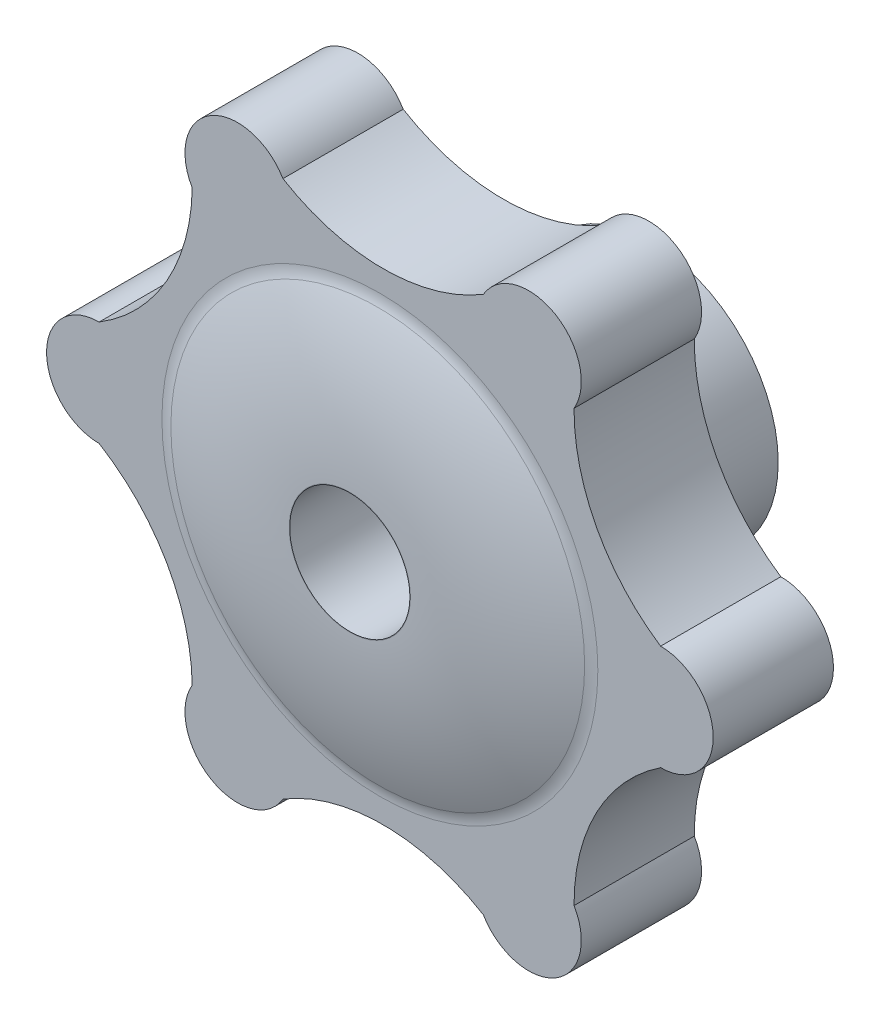
ISO-10303-21;
HEADER;
FILE_DESCRIPTION(('STEP AP214'),'2;1');
FILE_NAME('part.step','',(''),(''),'','','');
FILE_SCHEMA(('AUTOMOTIVE_DESIGN { 1 0 10303 214 1 1 1 1 }'));
ENDSEC;
DATA;
#1=APPLICATION_CONTEXT('core data for automotive mechanical design processes');
#2=APPLICATION_PROTOCOL_DEFINITION('international standard','automotive_design',2000,#1);
#3=PRODUCT_CONTEXT('',#1,'mechanical');
#4=PRODUCT('Part','Part','',(#3));
#5=PRODUCT_RELATED_PRODUCT_CATEGORY('part','',(#4));
#6=PRODUCT_DEFINITION_FORMATION('','',#4);
#7=PRODUCT_DEFINITION_CONTEXT('part definition',#1,'design');
#8=PRODUCT_DEFINITION('design','',#6,#7);
#9=PRODUCT_DEFINITION_SHAPE('','',#8);
#10=(LENGTH_UNIT() NAMED_UNIT(*) SI_UNIT(.MILLI.,.METRE.));
#11=(NAMED_UNIT(*) PLANE_ANGLE_UNIT() SI_UNIT($,.RADIAN.));
#12=(NAMED_UNIT(*) SI_UNIT($,.STERADIAN.) SOLID_ANGLE_UNIT());
#13=UNCERTAINTY_MEASURE_WITH_UNIT(LENGTH_MEASURE(1.E-05),#10,'distance_accuracy_value','');
#14=(GEOMETRIC_REPRESENTATION_CONTEXT(3) GLOBAL_UNCERTAINTY_ASSIGNED_CONTEXT((#13)) GLOBAL_UNIT_ASSIGNED_CONTEXT((#10,
#11,#12)) REPRESENTATION_CONTEXT('',''));
#15=CARTESIAN_POINT('',(0.,0.,0.));
#16=DIRECTION('',(0.,0.,1.));
#17=DIRECTION('',(1.,0.,0.));
#18=AXIS2_PLACEMENT_3D('',#15,#16,#17);
#19=CARTESIAN_POINT('',(0.217287644994759,-28.9128958259195,8.));
#20=DIRECTION('',(0.,0.,-1.));
#21=DIRECTION('',(-1.,0.,0.));
#22=AXIS2_PLACEMENT_3D('',#19,#20,#21);
#23=CYLINDRICAL_SURFACE('',#22,12.8967534727);
#24=CARTESIAN_POINT('',(0.217287644994759,-28.9128958259195,0.));
#25=DIRECTION('',(0.,0.,1.));
#26=DIRECTION('',(1.,0.,0.));
#27=AXIS2_PLACEMENT_3D('',#24,#25,#26);
#28=CIRCLE('',#27,12.8967534727);
#29=CARTESIAN_POINT('',(6.88295195665951,-17.8722812859675,0.));
#30=VERTEX_POINT('',#29);
#31=CARTESIAN_POINT('',(-6.44837666667,-17.8722812859675,0.));
#32=VERTEX_POINT('',#31);
#33=EDGE_CURVE('E11',#30,#32,#28,.T.);
#34=ORIENTED_EDGE('',*,*,#33,.F.);
#35=DIRECTION('',(0.,0.,-1.));
#36=VECTOR('',#35,1.);
#37=CARTESIAN_POINT('',(6.88295195665951,-17.8722812859675,8.));
#38=LINE('',#37,#36);
#39=CARTESIAN_POINT('',(6.88295195665951,-17.8722812859675,8.));
#40=VERTEX_POINT('',#39);
#41=EDGE_CURVE('E23',#40,#30,#38,.T.);
#42=ORIENTED_EDGE('',*,*,#41,.F.);
#43=CARTESIAN_POINT('',(0.217287644994759,-28.9128958259195,8.));
#44=DIRECTION('',(0.,0.,1.));
#45=DIRECTION('',(1.,0.,0.));
#46=AXIS2_PLACEMENT_3D('',#43,#44,#45);
#47=CIRCLE('',#46,12.8967534727);
#48=CARTESIAN_POINT('',(-6.44837666667,-17.8722812859675,8.));
#49=VERTEX_POINT('',#48);
#50=EDGE_CURVE('E204',#40,#49,#47,.T.);
#51=ORIENTED_EDGE('',*,*,#50,.T.);
#52=DIRECTION('',(0.,0.,-1.));
#53=VECTOR('',#52,1.);
#54=CARTESIAN_POINT('',(-6.44837666667,-17.8722812859675,8.));
#55=LINE('',#54,#53);
#56=EDGE_CURVE('E116',#49,#32,#55,.T.);
#57=ORIENTED_EDGE('',*,*,#56,.T.);
#58=EDGE_LOOP('',(#34,#42,#51,#57));
#59=FACE_BOUND('',#58,.T.);
#60=ADVANCED_FACE('F16',(#59),#23,.F.);
#61=CARTESIAN_POINT('',(9.9000570833054,-16.0982811014222,8.));
#62=DIRECTION('',(0.,0.,-1.));
#63=DIRECTION('',(-1.,0.,0.));
#64=AXIS2_PLACEMENT_3D('',#61,#62,#63);
#65=CYLINDRICAL_SURFACE('',#64,3.5);
#66=CARTESIAN_POINT('',(9.9000570833054,-16.0982811014222,0.));
#67=DIRECTION('',(0.,0.,1.));
#68=DIRECTION('',(1.,0.,0.));
#69=AXIS2_PLACEMENT_3D('',#66,#67,#68);
#70=CIRCLE('',#69,3.5);
#71=CARTESIAN_POINT('',(12.9171622099513,-14.3242809168767,0.));
#72=VERTEX_POINT('',#71);
#73=EDGE_CURVE('E201',#30,#72,#70,.T.);
#74=ORIENTED_EDGE('',*,*,#73,.T.);
#75=DIRECTION('',(0.,0.,-1.));
#76=VECTOR('',#75,1.);
#77=CARTESIAN_POINT('',(12.9171622099513,-14.3242809168767,8.));
#78=LINE('',#77,#76);
#79=CARTESIAN_POINT('',(12.9171622099513,-14.3242809168767,8.));
#80=VERTEX_POINT('',#79);
#81=EDGE_CURVE('E198',#80,#72,#78,.T.);
#82=ORIENTED_EDGE('',*,*,#81,.F.);
#83=CARTESIAN_POINT('',(9.9000570833054,-16.0982811014222,8.));
#84=DIRECTION('',(0.,0.,1.));
#85=DIRECTION('',(1.,0.,0.));
#86=AXIS2_PLACEMENT_3D('',#83,#84,#85);
#87=CIRCLE('',#86,3.5);
#88=EDGE_CURVE('E195',#40,#80,#87,.T.);
#89=ORIENTED_EDGE('',*,*,#88,.F.);
#90=ORIENTED_EDGE('',*,*,#41,.T.);
#91=EDGE_LOOP('',(#74,#82,#89,#90));
#92=FACE_BOUND('',#91,.T.);
#93=ADVANCED_FACE('F207',(#92),#65,.T.);
#94=CARTESIAN_POINT('',(25.813645209706,-14.2407562340763,8.));
#95=DIRECTION('',(0.,0.,-1.));
#96=DIRECTION('',(-1.,0.,0.));
#97=AXIS2_PLACEMENT_3D('',#94,#95,#96);
#98=CYLINDRICAL_SURFACE('',#97,12.8967534727);
#99=CARTESIAN_POINT('',(25.813645209706,-14.2407562340763,0.));
#100=DIRECTION('',(0.,0.,1.));
#101=DIRECTION('',(1.,0.,0.));
#102=AXIS2_PLACEMENT_3D('',#99,#100,#101);
#103=CIRCLE('',#102,12.8967534727);
#104=CARTESIAN_POINT('',(18.6748493969831,-3.5,0.));
#105=VERTEX_POINT('',#104);
#106=EDGE_CURVE('E192',#105,#72,#103,.T.);
#107=ORIENTED_EDGE('',*,*,#106,.F.);
#108=DIRECTION('',(0.,0.,-1.));
#109=VECTOR('',#108,1.);
#110=CARTESIAN_POINT('',(18.6748493969831,-3.5,8.));
#111=LINE('',#110,#109);
#112=CARTESIAN_POINT('',(18.6748493969831,-3.5,8.));
#113=VERTEX_POINT('',#112);
#114=EDGE_CURVE('E189',#113,#105,#111,.T.);
#115=ORIENTED_EDGE('',*,*,#114,.F.);
#116=CARTESIAN_POINT('',(25.813645209706,-14.2407562340763,8.));
#117=DIRECTION('',(0.,0.,1.));
#118=DIRECTION('',(1.,0.,0.));
#119=AXIS2_PLACEMENT_3D('',#116,#117,#118);
#120=CIRCLE('',#119,12.8967534727);
#121=EDGE_CURVE('E186',#113,#80,#120,.T.);
#122=ORIENTED_EDGE('',*,*,#121,.T.);
#123=ORIENTED_EDGE('',*,*,#81,.T.);
#124=EDGE_LOOP('',(#107,#115,#122,#123));
#125=FACE_BOUND('',#124,.T.);
#126=ADVANCED_FACE('F212',(#125),#98,.F.);
#127=CARTESIAN_POINT('',(18.6748493969831,0.,8.));
#128=DIRECTION('',(0.,0.,-1.));
#129=DIRECTION('',(-1.,0.,0.));
#130=AXIS2_PLACEMENT_3D('',#127,#128,#129);
#131=CYLINDRICAL_SURFACE('',#130,3.5);
#132=CARTESIAN_POINT('',(18.6748493969831,0.,0.));
#133=DIRECTION('',(0.,0.,1.));
#134=DIRECTION('',(1.,0.,0.));
#135=AXIS2_PLACEMENT_3D('',#132,#133,#134);
#136=CIRCLE('',#135,3.5);
#137=CARTESIAN_POINT('',(18.6748493969831,3.5,0.));
#138=VERTEX_POINT('',#137);
#139=EDGE_CURVE('E184',#105,#138,#136,.T.);
#140=ORIENTED_EDGE('',*,*,#139,.T.);
#141=DIRECTION('',(0.,0.,-1.));
#142=VECTOR('',#141,1.);
#143=CARTESIAN_POINT('',(18.6748493969831,3.5,8.));
#144=LINE('',#143,#142);
#145=CARTESIAN_POINT('',(18.6748493969831,3.5,8.));
#146=VERTEX_POINT('',#145);
#147=EDGE_CURVE('E181',#146,#138,#144,.T.);
#148=ORIENTED_EDGE('',*,*,#147,.F.);
#149=CARTESIAN_POINT('',(18.6748493969831,0.,8.));
#150=DIRECTION('',(0.,0.,1.));
#151=DIRECTION('',(1.,0.,0.));
#152=AXIS2_PLACEMENT_3D('',#149,#150,#151);
#153=CIRCLE('',#152,3.5);
#154=EDGE_CURVE('E178',#113,#146,#153,.T.);
#155=ORIENTED_EDGE('',*,*,#154,.F.);
#156=ORIENTED_EDGE('',*,*,#114,.T.);
#157=EDGE_LOOP('',(#140,#148,#155,#156));
#158=FACE_BOUND('',#157,.T.);
#159=ADVANCED_FACE('F215',(#158),#131,.T.);
#160=CARTESIAN_POINT('',(25.813645209706,14.2407562340763,8.));
#161=DIRECTION('',(0.,0.,-1.));
#162=DIRECTION('',(-1.,0.,0.));
#163=AXIS2_PLACEMENT_3D('',#160,#161,#162);
#164=CYLINDRICAL_SURFACE('',#163,12.8967534727);
#165=CARTESIAN_POINT('',(25.813645209706,14.2407562340763,0.));
#166=DIRECTION('',(0.,0.,1.));
#167=DIRECTION('',(1.,0.,0.));
#168=AXIS2_PLACEMENT_3D('',#165,#166,#167);
#169=CIRCLE('',#168,12.8967534727);
#170=CARTESIAN_POINT('',(12.9171622099513,14.3242809168767,0.));
#171=VERTEX_POINT('',#170);
#172=EDGE_CURVE('E175',#171,#138,#169,.T.);
#173=ORIENTED_EDGE('',*,*,#172,.F.);
#174=DIRECTION('',(0.,0.,-1.));
#175=VECTOR('',#174,1.);
#176=CARTESIAN_POINT('',(12.9171622099513,14.3242809168767,8.));
#177=LINE('',#176,#175);
#178=CARTESIAN_POINT('',(12.9171622099513,14.3242809168767,8.));
#179=VERTEX_POINT('',#178);
#180=EDGE_CURVE('E172',#179,#171,#177,.T.);
#181=ORIENTED_EDGE('',*,*,#180,.F.);
#182=CARTESIAN_POINT('',(25.813645209706,14.2407562340763,8.));
#183=DIRECTION('',(0.,0.,1.));
#184=DIRECTION('',(1.,0.,0.));
#185=AXIS2_PLACEMENT_3D('',#182,#183,#184);
#186=CIRCLE('',#185,12.8967534727);
#187=EDGE_CURVE('E169',#179,#146,#186,.T.);
#188=ORIENTED_EDGE('',*,*,#187,.T.);
#189=ORIENTED_EDGE('',*,*,#147,.T.);
#190=EDGE_LOOP('',(#173,#181,#188,#189));
#191=FACE_BOUND('',#190,.T.);
#192=ADVANCED_FACE('F235',(#191),#164,.F.);
#193=CARTESIAN_POINT('',(9.9000570833054,16.0982811014222,8.));
#194=DIRECTION('',(0.,0.,-1.));
#195=DIRECTION('',(-1.,0.,0.));
#196=AXIS2_PLACEMENT_3D('',#193,#194,#195);
#197=CYLINDRICAL_SURFACE('',#196,3.5);
#198=CARTESIAN_POINT('',(9.9000570833054,16.0982811014222,0.));
#199=DIRECTION('',(0.,0.,1.));
#200=DIRECTION('',(1.,0.,0.));
#201=AXIS2_PLACEMENT_3D('',#198,#199,#200);
#202=CIRCLE('',#201,3.5);
#203=CARTESIAN_POINT('',(6.88295195665951,17.8722812859675,0.));
#204=VERTEX_POINT('',#203);
#205=EDGE_CURVE('E167',#171,#204,#202,.T.);
#206=ORIENTED_EDGE('',*,*,#205,.T.);
#207=DIRECTION('',(0.,0.,-1.));
#208=VECTOR('',#207,1.);
#209=CARTESIAN_POINT('',(6.88295195665951,17.8722812859675,8.));
#210=LINE('',#209,#208);
#211=CARTESIAN_POINT('',(6.88295195665951,17.8722812859675,8.));
#212=VERTEX_POINT('',#211);
#213=EDGE_CURVE('E164',#212,#204,#210,.T.);
#214=ORIENTED_EDGE('',*,*,#213,.F.);
#215=CARTESIAN_POINT('',(9.9000570833054,16.0982811014222,8.));
#216=DIRECTION('',(0.,0.,1.));
#217=DIRECTION('',(1.,0.,0.));
#218=AXIS2_PLACEMENT_3D('',#215,#216,#217);
#219=CIRCLE('',#218,3.5);
#220=EDGE_CURVE('E161',#179,#212,#219,.T.);
#221=ORIENTED_EDGE('',*,*,#220,.F.);
#222=ORIENTED_EDGE('',*,*,#180,.T.);
#223=EDGE_LOOP('',(#206,#214,#221,#222));
#224=FACE_BOUND('',#223,.T.);
#225=ADVANCED_FACE('F233',(#224),#197,.T.);
#226=CARTESIAN_POINT('',(0.217287644994761,28.9128958259195,8.));
#227=DIRECTION('',(0.,0.,-1.));
#228=DIRECTION('',(-1.,0.,0.));
#229=AXIS2_PLACEMENT_3D('',#226,#227,#228);
#230=CYLINDRICAL_SURFACE('',#229,12.8967534727);
#231=CARTESIAN_POINT('',(0.217287644994761,28.9128958259195,0.));
#232=DIRECTION('',(0.,0.,1.));
#233=DIRECTION('',(1.,0.,0.));
#234=AXIS2_PLACEMENT_3D('',#231,#232,#233);
#235=CIRCLE('',#234,12.8967534727);
#236=CARTESIAN_POINT('',(-6.44837666667,17.8722812859675,0.));
#237=VERTEX_POINT('',#236);
#238=EDGE_CURVE('E158',#237,#204,#235,.T.);
#239=ORIENTED_EDGE('',*,*,#238,.F.);
#240=DIRECTION('',(0.,0.,-1.));
#241=VECTOR('',#240,1.);
#242=CARTESIAN_POINT('',(-6.44837666667,17.8722812859675,8.));
#243=LINE('',#242,#241);
#244=CARTESIAN_POINT('',(-6.44837666667,17.8722812859675,8.));
#245=VERTEX_POINT('',#244);
#246=EDGE_CURVE('E155',#245,#237,#243,.T.);
#247=ORIENTED_EDGE('',*,*,#246,.F.);
#248=CARTESIAN_POINT('',(0.217287644994761,28.9128958259195,8.));
#249=DIRECTION('',(0.,0.,1.));
#250=DIRECTION('',(1.,0.,0.));
#251=AXIS2_PLACEMENT_3D('',#248,#249,#250);
#252=CIRCLE('',#251,12.8967534727);
#253=EDGE_CURVE('E152',#245,#212,#252,.T.);
#254=ORIENTED_EDGE('',*,*,#253,.T.);
#255=ORIENTED_EDGE('',*,*,#213,.T.);
#256=EDGE_LOOP('',(#239,#247,#254,#255));
#257=FACE_BOUND('',#256,.T.);
#258=ADVANCED_FACE('F230',(#257),#230,.F.);
#259=CARTESIAN_POINT('',(-9.46548179331588,16.0982811014222,8.));
#260=DIRECTION('',(0.,0.,-1.));
#261=DIRECTION('',(-1.,0.,0.));
#262=AXIS2_PLACEMENT_3D('',#259,#260,#261);
#263=CYLINDRICAL_SURFACE('',#262,3.5);
#264=CARTESIAN_POINT('',(-9.46548179331588,16.0982811014222,0.));
#265=DIRECTION('',(0.,0.,1.));
#266=DIRECTION('',(1.,0.,0.));
#267=AXIS2_PLACEMENT_3D('',#264,#265,#266);
#268=CIRCLE('',#267,3.5);
#269=CARTESIAN_POINT('',(-12.4825869199618,14.3242809168767,0.));
#270=VERTEX_POINT('',#269);
#271=EDGE_CURVE('E150',#237,#270,#268,.T.);
#272=ORIENTED_EDGE('',*,*,#271,.T.);
#273=DIRECTION('',(0.,0.,-1.));
#274=VECTOR('',#273,1.);
#275=CARTESIAN_POINT('',(-12.4825869199618,14.3242809168767,8.));
#276=LINE('',#275,#274);
#277=CARTESIAN_POINT('',(-12.4825869199618,14.3242809168767,8.));
#278=VERTEX_POINT('',#277);
#279=EDGE_CURVE('E147',#278,#270,#276,.T.);
#280=ORIENTED_EDGE('',*,*,#279,.F.);
#281=CARTESIAN_POINT('',(-9.46548179331588,16.0982811014222,8.));
#282=DIRECTION('',(0.,0.,1.));
#283=DIRECTION('',(1.,0.,0.));
#284=AXIS2_PLACEMENT_3D('',#281,#282,#283);
#285=CIRCLE('',#284,3.5);
#286=EDGE_CURVE('E144',#245,#278,#285,.T.);
#287=ORIENTED_EDGE('',*,*,#286,.F.);
#288=ORIENTED_EDGE('',*,*,#246,.T.);
#289=EDGE_LOOP('',(#272,#280,#287,#288));
#290=FACE_BOUND('',#289,.T.);
#291=ADVANCED_FACE('F226',(#290),#263,.T.);
#292=CARTESIAN_POINT('',(-25.3778859330253,14.5179649360526,8.));
#293=DIRECTION('',(0.,0.,-1.));
#294=DIRECTION('',(-1.,0.,0.));
#295=AXIS2_PLACEMENT_3D('',#292,#293,#294);
#296=CYLINDRICAL_SURFACE('',#295,12.8967534727);
#297=CARTESIAN_POINT('',(-25.3778859330253,14.5179649360526,0.));
#298=DIRECTION('',(0.,0.,1.));
#299=DIRECTION('',(1.,0.,0.));
#300=AXIS2_PLACEMENT_3D('',#297,#298,#299);
#301=CIRCLE('',#300,12.8967534727);
#302=CARTESIAN_POINT('',(-18.6748493969831,3.5,0.));
#303=VERTEX_POINT('',#302);
#304=EDGE_CURVE('E141',#303,#270,#301,.T.);
#305=ORIENTED_EDGE('',*,*,#304,.F.);
#306=DIRECTION('',(0.,0.,-1.));
#307=VECTOR('',#306,1.);
#308=CARTESIAN_POINT('',(-18.6748493969831,3.5,8.));
#309=LINE('',#308,#307);
#310=CARTESIAN_POINT('',(-18.6748493969831,3.5,8.));
#311=VERTEX_POINT('',#310);
#312=EDGE_CURVE('E138',#311,#303,#309,.T.);
#313=ORIENTED_EDGE('',*,*,#312,.F.);
#314=CARTESIAN_POINT('',(-25.3778859330253,14.5179649360526,8.));
#315=DIRECTION('',(0.,0.,1.));
#316=DIRECTION('',(1.,0.,0.));
#317=AXIS2_PLACEMENT_3D('',#314,#315,#316);
#318=CIRCLE('',#317,12.8967534727);
#319=EDGE_CURVE('E135',#311,#278,#318,.T.);
#320=ORIENTED_EDGE('',*,*,#319,.T.);
#321=ORIENTED_EDGE('',*,*,#279,.T.);
#322=EDGE_LOOP('',(#305,#313,#320,#321));
#323=FACE_BOUND('',#322,.T.);
#324=ADVANCED_FACE('F223',(#323),#296,.F.);
#325=CARTESIAN_POINT('',(-18.6748493969831,0.,8.));
#326=DIRECTION('',(0.,0.,-1.));
#327=DIRECTION('',(-1.,0.,0.));
#328=AXIS2_PLACEMENT_3D('',#325,#326,#327);
#329=CYLINDRICAL_SURFACE('',#328,3.5);
#330=CARTESIAN_POINT('',(-18.6748493969831,0.,0.));
#331=DIRECTION('',(0.,0.,1.));
#332=DIRECTION('',(1.,0.,0.));
#333=AXIS2_PLACEMENT_3D('',#330,#331,#332);
#334=CIRCLE('',#333,3.5);
#335=CARTESIAN_POINT('',(-18.6748493969831,-3.5,0.));
#336=VERTEX_POINT('',#335);
#337=EDGE_CURVE('E133',#303,#336,#334,.T.);
#338=ORIENTED_EDGE('',*,*,#337,.T.);
#339=DIRECTION('',(0.,0.,-1.));
#340=VECTOR('',#339,1.);
#341=CARTESIAN_POINT('',(-18.6748493969831,-3.5,8.));
#342=LINE('',#341,#340);
#343=CARTESIAN_POINT('',(-18.6748493969831,-3.5,8.));
#344=VERTEX_POINT('',#343);
#345=EDGE_CURVE('E131',#344,#336,#342,.T.);
#346=ORIENTED_EDGE('',*,*,#345,.F.);
#347=CARTESIAN_POINT('',(-18.6748493969831,0.,8.));
#348=DIRECTION('',(0.,0.,1.));
#349=DIRECTION('',(1.,0.,0.));
#350=AXIS2_PLACEMENT_3D('',#347,#348,#349);
#351=CIRCLE('',#350,3.5);
#352=EDGE_CURVE('E125',#311,#344,#351,.T.);
#353=ORIENTED_EDGE('',*,*,#352,.F.);
#354=ORIENTED_EDGE('',*,*,#312,.T.);
#355=EDGE_LOOP('',(#338,#346,#353,#354));
#356=FACE_BOUND('',#355,.T.);
#357=ADVANCED_FACE('F221',(#356),#329,.T.);
#358=CARTESIAN_POINT('',(-25.3778859330252,-14.5179649360526,8.));
#359=DIRECTION('',(0.,0.,-1.));
#360=DIRECTION('',(-1.,0.,0.));
#361=AXIS2_PLACEMENT_3D('',#358,#359,#360);
#362=CYLINDRICAL_SURFACE('',#361,12.8967534727);
#363=CARTESIAN_POINT('',(-25.3778859330252,-14.5179649360526,0.));
#364=DIRECTION('',(0.,0.,1.));
#365=DIRECTION('',(1.,0.,0.));
#366=AXIS2_PLACEMENT_3D('',#363,#364,#365);
#367=CIRCLE('',#366,12.8967534727);
#368=CARTESIAN_POINT('',(-12.4825869199618,-14.3242809168767,0.));
#369=VERTEX_POINT('',#368);
#370=EDGE_CURVE('E107',#369,#336,#367,.T.);
#371=ORIENTED_EDGE('',*,*,#370,.F.);
#372=DIRECTION('',(0.,0.,-1.));
#373=VECTOR('',#372,1.);
#374=CARTESIAN_POINT('',(-12.4825869199618,-14.3242809168767,8.));
#375=LINE('',#374,#373);
#376=CARTESIAN_POINT('',(-12.4825869199618,-14.3242809168767,8.));
#377=VERTEX_POINT('',#376);
#378=EDGE_CURVE('E99',#377,#369,#375,.T.);
#379=ORIENTED_EDGE('',*,*,#378,.F.);
#380=CARTESIAN_POINT('',(-25.3778859330252,-14.5179649360526,8.));
#381=DIRECTION('',(0.,0.,1.));
#382=DIRECTION('',(1.,0.,0.));
#383=AXIS2_PLACEMENT_3D('',#380,#381,#382);
#384=CIRCLE('',#383,12.8967534727);
#385=EDGE_CURVE('E104',#377,#344,#384,.T.);
#386=ORIENTED_EDGE('',*,*,#385,.T.);
#387=ORIENTED_EDGE('',*,*,#345,.T.);
#388=EDGE_LOOP('',(#371,#379,#386,#387));
#389=FACE_BOUND('',#388,.T.);
#390=ADVANCED_FACE('F101',(#389),#362,.F.);
#391=CARTESIAN_POINT('',(-9.46548179331588,-16.0982811014222,8.));
#392=DIRECTION('',(0.,0.,-1.));
#393=DIRECTION('',(-1.,0.,0.));
#394=AXIS2_PLACEMENT_3D('',#391,#392,#393);
#395=CYLINDRICAL_SURFACE('',#394,3.5);
#396=CARTESIAN_POINT('',(-9.46548179331588,-16.0982811014222,0.));
#397=DIRECTION('',(0.,0.,1.));
#398=DIRECTION('',(1.,0.,0.));
#399=AXIS2_PLACEMENT_3D('',#396,#397,#398);
#400=CIRCLE('',#399,3.5);
#401=EDGE_CURVE('E119',#369,#32,#400,.T.);
#402=ORIENTED_EDGE('',*,*,#401,.T.);
#403=ORIENTED_EDGE('',*,*,#56,.F.);
#404=CARTESIAN_POINT('',(-9.46548179331588,-16.0982811014222,8.));
#405=DIRECTION('',(0.,0.,1.));
#406=DIRECTION('',(1.,0.,0.));
#407=AXIS2_PLACEMENT_3D('',#404,#405,#406);
#408=CIRCLE('',#407,3.5);
#409=EDGE_CURVE('E114',#377,#49,#408,.T.);
#410=ORIENTED_EDGE('',*,*,#409,.F.);
#411=ORIENTED_EDGE('',*,*,#378,.T.);
#412=EDGE_LOOP('',(#402,#403,#410,#411));
#413=FACE_BOUND('',#412,.T.);
#414=ADVANCED_FACE('F115',(#413),#395,.T.);
#415=CARTESIAN_POINT('',(0.,0.,8.));
#416=DIRECTION('',(0.,0.,1.));
#417=DIRECTION('',(1.,0.,0.));
#418=AXIS2_PLACEMENT_3D('',#415,#416,#417);
#419=PLANE('',#418);
#420=CARTESIAN_POINT('',(0.,0.,8.));
#421=DIRECTION('',(0.,0.,1.));
#422=DIRECTION('',(1.,0.,0.));
#423=AXIS2_PLACEMENT_3D('',#420,#421,#422);
#424=CIRCLE('',#423,14.5);
#425=CARTESIAN_POINT('',(14.5,0.,8.));
#426=VERTEX_POINT('',#425);
#427=EDGE_CURVE('E120',#426,#426,#424,.F.);
#428=ORIENTED_EDGE('',*,*,#427,.T.);
#429=EDGE_LOOP('',(#428));
#430=FACE_BOUND('',#429,.T.);
#431=ORIENTED_EDGE('',*,*,#50,.F.);
#432=ORIENTED_EDGE('',*,*,#88,.T.);
#433=ORIENTED_EDGE('',*,*,#121,.F.);
#434=ORIENTED_EDGE('',*,*,#154,.T.);
#435=ORIENTED_EDGE('',*,*,#187,.F.);
#436=ORIENTED_EDGE('',*,*,#220,.T.);
#437=ORIENTED_EDGE('',*,*,#253,.F.);
#438=ORIENTED_EDGE('',*,*,#286,.T.);
#439=ORIENTED_EDGE('',*,*,#319,.F.);
#440=ORIENTED_EDGE('',*,*,#352,.T.);
#441=ORIENTED_EDGE('',*,*,#385,.F.);
#442=ORIENTED_EDGE('',*,*,#409,.T.);
#443=EDGE_LOOP('',(#431,#432,#433,#434,#435,#436,#437,#438,#439,#440,#441,#442));
#444=FACE_BOUND('',#443,.T.);
#445=ADVANCED_FACE('F122',(#430,#444),#419,.T.);
#446=CARTESIAN_POINT('',(0.,0.,0.));
#447=DIRECTION('',(0.,0.,1.));
#448=DIRECTION('',(1.,0.,0.));
#449=AXIS2_PLACEMENT_3D('',#446,#447,#448);
#450=PLANE('',#449);
#451=CARTESIAN_POINT('',(0.,0.,0.));
#452=DIRECTION('',(0.,0.,-1.));
#453=DIRECTION('',(-1.,0.,0.));
#454=AXIS2_PLACEMENT_3D('',#451,#452,#453);
#455=CIRCLE('',#454,14.5);
#456=CARTESIAN_POINT('',(-14.5,0.,0.));
#457=VERTEX_POINT('',#456);
#458=EDGE_CURVE('E454',#457,#457,#455,.T.);
#459=ORIENTED_EDGE('',*,*,#458,.F.);
#460=EDGE_LOOP('',(#459));
#461=FACE_BOUND('',#460,.T.);
#462=ORIENTED_EDGE('',*,*,#33,.T.);
#463=ORIENTED_EDGE('',*,*,#401,.F.);
#464=ORIENTED_EDGE('',*,*,#370,.T.);
#465=ORIENTED_EDGE('',*,*,#337,.F.);
#466=ORIENTED_EDGE('',*,*,#304,.T.);
#467=ORIENTED_EDGE('',*,*,#271,.F.);
#468=ORIENTED_EDGE('',*,*,#238,.T.);
#469=ORIENTED_EDGE('',*,*,#205,.F.);
#470=ORIENTED_EDGE('',*,*,#172,.T.);
#471=ORIENTED_EDGE('',*,*,#139,.F.);
#472=ORIENTED_EDGE('',*,*,#106,.T.);
#473=ORIENTED_EDGE('',*,*,#73,.F.);
#474=EDGE_LOOP('',(#462,#463,#464,#465,#466,#467,#468,#469,#470,#471,#472,#473));
#475=FACE_BOUND('',#474,.T.);
#476=ADVANCED_FACE('F209',(#461,#475),#450,.F.);
#477=CARTESIAN_POINT('',(0.,0.,10.));
#478=DIRECTION('',(0.,0.,1.));
#479=DIRECTION('',(1.,0.,0.));
#480=AXIS2_PLACEMENT_3D('',#477,#478,#479);
#481=PLANE('',#480);
#482=CARTESIAN_POINT('',(0.,0.,10.));
#483=DIRECTION('',(0.,0.,1.));
#484=DIRECTION('',(1.,0.,0.));
#485=AXIS2_PLACEMENT_3D('',#482,#483,#484);
#486=CIRCLE('',#485,4.);
#487=CARTESIAN_POINT('',(4.,0.,10.));
#488=VERTEX_POINT('',#487);
#489=EDGE_CURVE('E451',#488,#488,#486,.T.);
#490=ORIENTED_EDGE('',*,*,#489,.F.);
#491=EDGE_LOOP('',(#490));
#492=FACE_BOUND('',#491,.T.);
#493=CARTESIAN_POINT('',(0.,0.,10.));
#494=DIRECTION('',(0.,0.,1.));
#495=DIRECTION('',(1.,0.,0.));
#496=AXIS2_PLACEMENT_3D('',#493,#494,#495);
#497=CIRCLE('',#496,4.03099813735807);
#498=CARTESIAN_POINT('',(4.03099813735807,0.,10.));
#499=VERTEX_POINT('',#498);
#500=EDGE_CURVE('E448',#499,#499,#497,.T.);
#501=ORIENTED_EDGE('',*,*,#500,.T.);
#502=EDGE_LOOP('',(#501));
#503=FACE_BOUND('',#502,.T.);
#504=ADVANCED_FACE('F344',(#492,#503),#481,.T.);
#505=CARTESIAN_POINT('',(0.,0.,10.));
#506=DIRECTION('',(0.,0.,1.));
#507=DIRECTION('',(1.,0.,0.));
#508=AXIS2_PLACEMENT_3D('',#505,#506,#507);
#509=TOROIDAL_SURFACE('',#508,14.5,2.);
#510=CARTESIAN_POINT('',(0.,0.,8.14084507042247));
#511=DIRECTION('',(0.,0.,1.));
#512=DIRECTION('',(1.,0.,0.));
#513=AXIS2_PLACEMENT_3D('',#510,#511,#512);
#514=CIRCLE('',#513,13.7627463477013);
#515=CARTESIAN_POINT('',(13.7627463477013,0.,8.14084507042247));
#516=VERTEX_POINT('',#515);
#517=EDGE_CURVE('E445',#516,#516,#514,.F.);
#518=ORIENTED_EDGE('',*,*,#517,.T.);
#519=EDGE_LOOP('',(#518));
#520=FACE_BOUND('',#519,.T.);
#521=ORIENTED_EDGE('',*,*,#427,.F.);
#522=EDGE_LOOP('',(#521));
#523=FACE_BOUND('',#522,.T.);
#524=ADVANCED_FACE('F354',(#520,#523),#509,.F.);
#525=CARTESIAN_POINT('',(0.,0.,-16.4));
#526=DIRECTION('',(0.,0.,-1.));
#527=DIRECTION('',(-1.,0.,0.));
#528=AXIS2_PLACEMENT_3D('',#525,#526,#527);
#529=DEGENERATE_TOROIDAL_SURFACE('',#528,4.03099813735807,26.4,.T.);
#530=ORIENTED_EDGE('',*,*,#517,.F.);
#531=EDGE_LOOP('',(#530));
#532=FACE_BOUND('',#531,.T.);
#533=ORIENTED_EDGE('',*,*,#500,.F.);
#534=EDGE_LOOP('',(#533));
#535=FACE_BOUND('',#534,.T.);
#536=ADVANCED_FACE('F364',(#532,#535),#529,.T.);
#537=CARTESIAN_POINT('',(0.,0.,-15.));
#538=DIRECTION('',(0.,0.,1.));
#539=DIRECTION('',(1.,0.,0.));
#540=AXIS2_PLACEMENT_3D('',#537,#538,#539);
#541=CYLINDRICAL_SURFACE('',#540,4.);
#542=ORIENTED_EDGE('',*,*,#489,.T.);
#543=EDGE_LOOP('',(#542));
#544=FACE_BOUND('',#543,.T.);
#545=CARTESIAN_POINT('',(0.,0.,-10.));
#546=DIRECTION('',(0.,0.,1.));
#547=DIRECTION('',(1.,0.,0.));
#548=AXIS2_PLACEMENT_3D('',#545,#546,#547);
#549=CIRCLE('',#548,4.);
#550=CARTESIAN_POINT('',(4.,0.,-10.));
#551=VERTEX_POINT('',#550);
#552=EDGE_CURVE('E431',#551,#551,#549,.T.);
#553=ORIENTED_EDGE('',*,*,#552,.F.);
#554=EDGE_LOOP('',(#553));
#555=FACE_BOUND('',#554,.T.);
#556=ADVANCED_FACE('F374',(#544,#555),#541,.F.);
#557=CARTESIAN_POINT('',(0.,0.,4.5));
#558=DIRECTION('',(0.,0.,-1.));
#559=DIRECTION('',(-1.,0.,0.));
#560=AXIS2_PLACEMENT_3D('',#557,#558,#559);
#561=CYLINDRICAL_SURFACE('',#560,8.5);
#562=CARTESIAN_POINT('',(0.,0.,4.5));
#563=DIRECTION('',(0.,0.,-1.));
#564=DIRECTION('',(-1.,0.,0.));
#565=AXIS2_PLACEMENT_3D('',#562,#563,#564);
#566=CIRCLE('',#565,8.5);
#567=CARTESIAN_POINT('',(-8.5,0.,4.5));
#568=VERTEX_POINT('',#567);
#569=EDGE_CURVE('E436',#568,#568,#566,.T.);
#570=ORIENTED_EDGE('',*,*,#569,.T.);
#571=EDGE_LOOP('',(#570));
#572=FACE_BOUND('',#571,.T.);
#573=CARTESIAN_POINT('',(0.,0.,-10.));
#574=DIRECTION('',(0.,0.,-1.));
#575=DIRECTION('',(-1.,0.,0.));
#576=AXIS2_PLACEMENT_3D('',#573,#574,#575);
#577=CIRCLE('',#576,8.5);
#578=CARTESIAN_POINT('',(-8.5,0.,-10.));
#579=VERTEX_POINT('',#578);
#580=EDGE_CURVE('E434',#579,#579,#577,.T.);
#581=ORIENTED_EDGE('',*,*,#580,.F.);
#582=EDGE_LOOP('',(#581));
#583=FACE_BOUND('',#582,.T.);
#584=ADVANCED_FACE('F384',(#572,#583),#561,.T.);
#585=CARTESIAN_POINT('',(0.,0.,4.5));
#586=DIRECTION('',(0.,0.,-1.));
#587=DIRECTION('',(-1.,0.,0.));
#588=AXIS2_PLACEMENT_3D('',#585,#586,#587);
#589=CYLINDRICAL_SURFACE('',#588,14.5);
#590=CARTESIAN_POINT('',(0.,0.,4.5));
#591=DIRECTION('',(0.,0.,-1.));
#592=DIRECTION('',(-1.,0.,0.));
#593=AXIS2_PLACEMENT_3D('',#590,#591,#592);
#594=CIRCLE('',#593,14.5);
#595=CARTESIAN_POINT('',(-14.5,0.,4.5));
#596=VERTEX_POINT('',#595);
#597=EDGE_CURVE('E437',#596,#596,#594,.T.);
#598=ORIENTED_EDGE('',*,*,#597,.F.);
#599=EDGE_LOOP('',(#598));
#600=FACE_BOUND('',#599,.T.);
#601=ORIENTED_EDGE('',*,*,#458,.T.);
#602=EDGE_LOOP('',(#601));
#603=FACE_BOUND('',#602,.T.);
#604=ADVANCED_FACE('F394',(#600,#603),#589,.F.);
#605=CARTESIAN_POINT('',(0.,0.,4.5));
#606=DIRECTION('',(0.,0.,-1.));
#607=DIRECTION('',(1.,0.,0.));
#608=AXIS2_PLACEMENT_3D('',#605,#606,#607);
#609=PLANE('',#608);
#610=ORIENTED_EDGE('',*,*,#569,.F.);
#611=EDGE_LOOP('',(#610));
#612=FACE_BOUND('',#611,.T.);
#613=ORIENTED_EDGE('',*,*,#597,.T.);
#614=EDGE_LOOP('',(#613));
#615=FACE_BOUND('',#614,.T.);
#616=ADVANCED_FACE('F404',(#612,#615),#609,.T.);
#617=CARTESIAN_POINT('',(0.,0.,-10.));
#618=DIRECTION('',(0.,0.,-1.));
#619=DIRECTION('',(1.,0.,0.));
#620=AXIS2_PLACEMENT_3D('',#617,#618,#619);
#621=PLANE('',#620);
#622=ORIENTED_EDGE('',*,*,#552,.T.);
#623=EDGE_LOOP('',(#622));
#624=FACE_BOUND('',#623,.T.);
#625=ORIENTED_EDGE('',*,*,#580,.T.);
#626=EDGE_LOOP('',(#625));
#627=FACE_BOUND('',#626,.T.);
#628=ADVANCED_FACE('F414',(#624,#627),#621,.T.);
#629=CLOSED_SHELL('',(#60,#93,#126,#159,#192,#225,#258,#291,#324,#357,#390,#414,#445,#476,#504,
#524,#536,#556,#584,#604,#616,#628));
#630=MANIFOLD_SOLID_BREP('B1',#629);
#631=ADVANCED_BREP_SHAPE_REPRESENTATION('',(#18,#630),#14);
#632=SHAPE_DEFINITION_REPRESENTATION(#9,#631);
ENDSEC;
END-ISO-10303-21;
